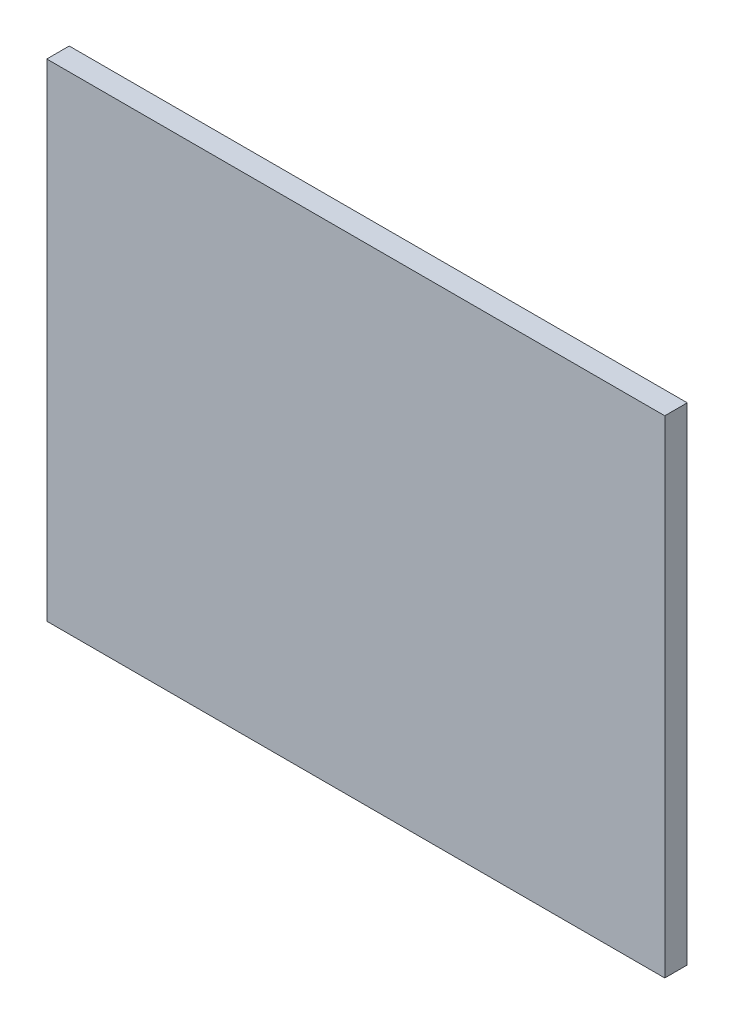
ISO-10303-21;
HEADER;
FILE_DESCRIPTION(('STEP AP214'),'2;1');
FILE_NAME('part.step','',(''),(''),'','','');
FILE_SCHEMA(('AUTOMOTIVE_DESIGN { 1 0 10303 214 1 1 1 1 }'));
ENDSEC;
DATA;
#1=APPLICATION_CONTEXT('core data for automotive mechanical design processes');
#2=APPLICATION_PROTOCOL_DEFINITION('international standard','automotive_design',2000,#1);
#3=PRODUCT_CONTEXT('',#1,'mechanical');
#4=PRODUCT('Part','Part','',(#3));
#5=PRODUCT_RELATED_PRODUCT_CATEGORY('part','',(#4));
#6=PRODUCT_DEFINITION_FORMATION('','',#4);
#7=PRODUCT_DEFINITION_CONTEXT('part definition',#1,'design');
#8=PRODUCT_DEFINITION('design','',#6,#7);
#9=PRODUCT_DEFINITION_SHAPE('','',#8);
#10=(LENGTH_UNIT() NAMED_UNIT(*) SI_UNIT(.MILLI.,.METRE.));
#11=(NAMED_UNIT(*) PLANE_ANGLE_UNIT() SI_UNIT($,.RADIAN.));
#12=(NAMED_UNIT(*) SI_UNIT($,.STERADIAN.) SOLID_ANGLE_UNIT());
#13=UNCERTAINTY_MEASURE_WITH_UNIT(LENGTH_MEASURE(1.E-05),#10,'distance_accuracy_value','');
#14=(GEOMETRIC_REPRESENTATION_CONTEXT(3) GLOBAL_UNCERTAINTY_ASSIGNED_CONTEXT((#13)) GLOBAL_UNIT_ASSIGNED_CONTEXT((#10,
#11,#12)) REPRESENTATION_CONTEXT('',''));
#15=CARTESIAN_POINT('',(0.,0.,0.));
#16=DIRECTION('',(0.,0.,1.));
#17=DIRECTION('',(1.,0.,0.));
#18=AXIS2_PLACEMENT_3D('',#15,#16,#17);
#19=CARTESIAN_POINT('',(-40.9964753587024,-31.7394260761073,1.5));
#20=DIRECTION('',(1.,0.,0.));
#21=DIRECTION('',(0.,0.,-1.));
#22=AXIS2_PLACEMENT_3D('',#19,#20,#21);
#23=PLANE('',#22);
#24=DIRECTION('',(0.,-1.,0.));
#25=VECTOR('',#24,1.);
#26=CARTESIAN_POINT('',(-40.9964753587024,-31.7394260761073,-1.5));
#27=LINE('',#26,#25);
#28=CARTESIAN_POINT('',(-40.9964753587024,33.2605739238927,-1.5));
#29=VERTEX_POINT('',#28);
#30=CARTESIAN_POINT('',(-40.9964753587024,-31.7394260761073,-1.5));
#31=VERTEX_POINT('',#30);
#32=EDGE_CURVE('E186',#29,#31,#27,.T.);
#33=ORIENTED_EDGE('',*,*,#32,.T.);
#34=DIRECTION('',(0.,0.,-1.));
#35=VECTOR('',#34,1.);
#36=CARTESIAN_POINT('',(-40.9964753587024,-31.7394260761073,1.5));
#37=LINE('',#36,#35);
#38=CARTESIAN_POINT('',(-40.9964753587024,-31.7394260761073,1.5));
#39=VERTEX_POINT('',#38);
#40=EDGE_CURVE('E11',#39,#31,#37,.T.);
#41=ORIENTED_EDGE('',*,*,#40,.F.);
#42=DIRECTION('',(0.,-1.,0.));
#43=VECTOR('',#42,1.);
#44=CARTESIAN_POINT('',(-40.9964753587024,-31.7394260761073,1.5));
#45=LINE('',#44,#43);
#46=CARTESIAN_POINT('',(-40.9964753587024,33.2605739238927,1.5));
#47=VERTEX_POINT('',#46);
#48=EDGE_CURVE('E192',#47,#39,#45,.T.);
#49=ORIENTED_EDGE('',*,*,#48,.F.);
#50=DIRECTION('',(0.,0.,-1.));
#51=VECTOR('',#50,1.);
#52=CARTESIAN_POINT('',(-40.9964753587024,33.2605739238927,1.5));
#53=LINE('',#52,#51);
#54=EDGE_CURVE('E202',#47,#29,#53,.T.);
#55=ORIENTED_EDGE('',*,*,#54,.T.);
#56=EDGE_LOOP('',(#33,#41,#49,#55));
#57=FACE_BOUND('',#56,.T.);
#58=ADVANCED_FACE('F32',(#57),#23,.F.);
#59=CARTESIAN_POINT('',(41.5035246412976,-31.7394260761073,1.5));
#60=DIRECTION('',(0.,1.,0.));
#61=DIRECTION('',(-1.,0.,0.));
#62=AXIS2_PLACEMENT_3D('',#59,#60,#61);
#63=PLANE('',#62);
#64=DIRECTION('',(1.,0.,0.));
#65=VECTOR('',#64,1.);
#66=CARTESIAN_POINT('',(41.5035246412976,-31.7394260761073,-1.5));
#67=LINE('',#66,#65);
#68=CARTESIAN_POINT('',(41.5035246412976,-31.7394260761073,-1.5));
#69=VERTEX_POINT('',#68);
#70=EDGE_CURVE('E205',#31,#69,#67,.T.);
#71=ORIENTED_EDGE('',*,*,#70,.T.);
#72=DIRECTION('',(0.,0.,-1.));
#73=VECTOR('',#72,1.);
#74=CARTESIAN_POINT('',(41.5035246412976,-31.7394260761073,1.5));
#75=LINE('',#74,#73);
#76=CARTESIAN_POINT('',(41.5035246412976,-31.7394260761073,1.5));
#77=VERTEX_POINT('',#76);
#78=EDGE_CURVE('E39',#77,#69,#75,.T.);
#79=ORIENTED_EDGE('',*,*,#78,.F.);
#80=DIRECTION('',(1.,0.,0.));
#81=VECTOR('',#80,1.);
#82=CARTESIAN_POINT('',(41.5035246412976,-31.7394260761073,1.5));
#83=LINE('',#82,#81);
#84=EDGE_CURVE('E195',#39,#77,#83,.T.);
#85=ORIENTED_EDGE('',*,*,#84,.F.);
#86=ORIENTED_EDGE('',*,*,#40,.T.);
#87=EDGE_LOOP('',(#71,#79,#85,#86));
#88=FACE_BOUND('',#87,.T.);
#89=ADVANCED_FACE('F235',(#88),#63,.F.);
#90=CARTESIAN_POINT('',(41.5035246412976,-31.7394260761073,1.5));
#91=DIRECTION('',(-1.,0.,0.));
#92=DIRECTION('',(0.,0.,1.));
#93=AXIS2_PLACEMENT_3D('',#90,#91,#92);
#94=PLANE('',#93);
#95=DIRECTION('',(0.,1.,0.));
#96=VECTOR('',#95,1.);
#97=CARTESIAN_POINT('',(41.5035246412976,-31.7394260761073,-1.5));
#98=LINE('',#97,#96);
#99=CARTESIAN_POINT('',(41.5035246412976,33.2605739238927,-1.5));
#100=VERTEX_POINT('',#99);
#101=EDGE_CURVE('E207',#69,#100,#98,.T.);
#102=ORIENTED_EDGE('',*,*,#101,.T.);
#103=DIRECTION('',(0.,0.,-1.));
#104=VECTOR('',#103,1.);
#105=CARTESIAN_POINT('',(41.5035246412976,33.2605739238927,1.5));
#106=LINE('',#105,#104);
#107=CARTESIAN_POINT('',(41.5035246412976,33.2605739238927,1.5));
#108=VERTEX_POINT('',#107);
#109=EDGE_CURVE('E212',#108,#100,#106,.T.);
#110=ORIENTED_EDGE('',*,*,#109,.F.);
#111=DIRECTION('',(0.,1.,0.));
#112=VECTOR('',#111,1.);
#113=CARTESIAN_POINT('',(41.5035246412976,-31.7394260761073,1.5));
#114=LINE('',#113,#112);
#115=EDGE_CURVE('E198',#77,#108,#114,.T.);
#116=ORIENTED_EDGE('',*,*,#115,.F.);
#117=ORIENTED_EDGE('',*,*,#78,.T.);
#118=EDGE_LOOP('',(#102,#110,#116,#117));
#119=FACE_BOUND('',#118,.T.);
#120=ADVANCED_FACE('F219',(#119),#94,.F.);
#121=CARTESIAN_POINT('',(41.5035246412976,33.2605739238927,1.5));
#122=DIRECTION('',(0.,-1.,0.));
#123=DIRECTION('',(0.,0.,-1.));
#124=AXIS2_PLACEMENT_3D('',#121,#122,#123);
#125=PLANE('',#124);
#126=DIRECTION('',(-1.,0.,0.));
#127=VECTOR('',#126,1.);
#128=CARTESIAN_POINT('',(41.5035246412976,33.2605739238927,-1.5));
#129=LINE('',#128,#127);
#130=EDGE_CURVE('E196',#100,#29,#129,.T.);
#131=ORIENTED_EDGE('',*,*,#130,.T.);
#132=ORIENTED_EDGE('',*,*,#54,.F.);
#133=DIRECTION('',(-1.,0.,0.));
#134=VECTOR('',#133,1.);
#135=CARTESIAN_POINT('',(41.5035246412976,33.2605739238927,1.5));
#136=LINE('',#135,#134);
#137=EDGE_CURVE('E200',#108,#47,#136,.T.);
#138=ORIENTED_EDGE('',*,*,#137,.F.);
#139=ORIENTED_EDGE('',*,*,#109,.T.);
#140=EDGE_LOOP('',(#131,#132,#138,#139));
#141=FACE_BOUND('',#140,.T.);
#142=ADVANCED_FACE('F228',(#141),#125,.F.);
#143=CARTESIAN_POINT('',(0.,0.,1.5));
#144=DIRECTION('',(0.,0.,1.));
#145=DIRECTION('',(1.,0.,0.));
#146=AXIS2_PLACEMENT_3D('',#143,#144,#145);
#147=PLANE('',#146);
#148=ORIENTED_EDGE('',*,*,#48,.T.);
#149=ORIENTED_EDGE('',*,*,#84,.T.);
#150=ORIENTED_EDGE('',*,*,#115,.T.);
#151=ORIENTED_EDGE('',*,*,#137,.T.);
#152=EDGE_LOOP('',(#148,#149,#150,#151));
#153=FACE_BOUND('',#152,.T.);
#154=ADVANCED_FACE('F234',(#153),#147,.T.);
#155=CARTESIAN_POINT('',(0.,0.,-1.5));
#156=DIRECTION('',(0.,0.,1.));
#157=DIRECTION('',(1.,0.,0.));
#158=AXIS2_PLACEMENT_3D('',#155,#156,#157);
#159=PLANE('',#158);
#160=DIRECTION('',(-1.,0.,0.));
#161=VECTOR('',#160,1.);
#162=CARTESIAN_POINT('',(37.3212385683419,-28.1056415969347,-1.5));
#163=LINE('',#162,#161);
#164=CARTESIAN_POINT('',(37.3212385683419,-28.1056415969347,-1.5));
#165=VERTEX_POINT('',#164);
#166=CARTESIAN_POINT('',(-38.0015055514087,-28.1056415969348,-1.5));
#167=VERTEX_POINT('',#166);
#168=EDGE_CURVE('E176',#165,#167,#163,.T.);
#169=ORIENTED_EDGE('',*,*,#168,.F.);
#170=DIRECTION('',(0.,-1.,0.));
#171=VECTOR('',#170,1.);
#172=CARTESIAN_POINT('',(37.3212385683419,28.1002399602976,-1.5));
#173=LINE('',#172,#171);
#174=CARTESIAN_POINT('',(37.3212385683419,28.1002399602976,-1.5));
#175=VERTEX_POINT('',#174);
#176=EDGE_CURVE('E46',#175,#165,#173,.T.);
#177=ORIENTED_EDGE('',*,*,#176,.F.);
#178=DIRECTION('',(1.,0.,0.));
#179=VECTOR('',#178,1.);
#180=CARTESIAN_POINT('',(-38.0015055514087,28.1002399602976,-1.5));
#181=LINE('',#180,#179);
#182=CARTESIAN_POINT('',(-38.0015055514087,28.1002399602976,-1.5));
#183=VERTEX_POINT('',#182);
#184=EDGE_CURVE('E165',#183,#175,#181,.T.);
#185=ORIENTED_EDGE('',*,*,#184,.F.);
#186=DIRECTION('',(0.,1.,0.));
#187=VECTOR('',#186,1.);
#188=CARTESIAN_POINT('',(-38.0015055514087,-28.1056415969348,-1.5));
#189=LINE('',#188,#187);
#190=EDGE_CURVE('E179',#167,#183,#189,.T.);
#191=ORIENTED_EDGE('',*,*,#190,.F.);
#192=EDGE_LOOP('',(#169,#177,#185,#191));
#193=FACE_BOUND('',#192,.T.);
#194=ORIENTED_EDGE('',*,*,#32,.F.);
#195=ORIENTED_EDGE('',*,*,#130,.F.);
#196=ORIENTED_EDGE('',*,*,#101,.F.);
#197=ORIENTED_EDGE('',*,*,#70,.F.);
#198=EDGE_LOOP('',(#194,#195,#196,#197));
#199=FACE_BOUND('',#198,.T.);
#200=ADVANCED_FACE('F225',(#193,#199),#159,.F.);
#201=CARTESIAN_POINT('',(37.3212385683419,28.1002399602976,0.));
#202=DIRECTION('',(1.,0.,0.));
#203=DIRECTION('',(0.,0.,-1.));
#204=AXIS2_PLACEMENT_3D('',#201,#202,#203);
#205=PLANE('',#204);
#206=ORIENTED_EDGE('',*,*,#176,.T.);
#207=DIRECTION('',(0.,0.,-1.));
#208=VECTOR('',#207,1.);
#209=CARTESIAN_POINT('',(37.3212385683419,-28.1056415969347,0.));
#210=LINE('',#209,#208);
#211=CARTESIAN_POINT('',(37.3212385683419,-28.1056415969347,0.));
#212=VERTEX_POINT('',#211);
#213=EDGE_CURVE('E174',#212,#165,#210,.T.);
#214=ORIENTED_EDGE('',*,*,#213,.F.);
#215=DIRECTION('',(0.,-1.,0.));
#216=VECTOR('',#215,1.);
#217=CARTESIAN_POINT('',(37.3212385683419,28.1002399602976,0.));
#218=LINE('',#217,#216);
#219=CARTESIAN_POINT('',(37.3212385683419,28.1002399602976,0.));
#220=VERTEX_POINT('',#219);
#221=EDGE_CURVE('E161',#220,#212,#218,.T.);
#222=ORIENTED_EDGE('',*,*,#221,.F.);
#223=DIRECTION('',(0.,0.,-1.));
#224=VECTOR('',#223,1.);
#225=CARTESIAN_POINT('',(37.3212385683419,28.1002399602976,0.));
#226=LINE('',#225,#224);
#227=EDGE_CURVE('E184',#220,#175,#226,.T.);
#228=ORIENTED_EDGE('',*,*,#227,.T.);
#229=EDGE_LOOP('',(#206,#214,#222,#228));
#230=FACE_BOUND('',#229,.T.);
#231=ADVANCED_FACE('F247',(#230),#205,.F.);
#232=CARTESIAN_POINT('',(-38.0015055514087,28.1002399602976,0.));
#233=DIRECTION('',(0.,1.,0.));
#234=DIRECTION('',(-1.,0.,0.));
#235=AXIS2_PLACEMENT_3D('',#232,#233,#234);
#236=PLANE('',#235);
#237=ORIENTED_EDGE('',*,*,#184,.T.);
#238=ORIENTED_EDGE('',*,*,#227,.F.);
#239=DIRECTION('',(1.,0.,0.));
#240=VECTOR('',#239,1.);
#241=CARTESIAN_POINT('',(-38.0015055514087,28.1002399602976,0.));
#242=LINE('',#241,#240);
#243=CARTESIAN_POINT('',(-38.0015055514087,28.1002399602976,0.));
#244=VERTEX_POINT('',#243);
#245=EDGE_CURVE('E171',#244,#220,#242,.T.);
#246=ORIENTED_EDGE('',*,*,#245,.F.);
#247=DIRECTION('',(0.,0.,-1.));
#248=VECTOR('',#247,1.);
#249=CARTESIAN_POINT('',(-38.0015055514087,28.1002399602976,0.));
#250=LINE('',#249,#248);
#251=EDGE_CURVE('E187',#244,#183,#250,.T.);
#252=ORIENTED_EDGE('',*,*,#251,.T.);
#253=EDGE_LOOP('',(#237,#238,#246,#252));
#254=FACE_BOUND('',#253,.T.);
#255=ADVANCED_FACE('F254',(#254),#236,.F.);
#256=CARTESIAN_POINT('',(-38.0015055514087,-28.1056415969348,0.));
#257=DIRECTION('',(-1.,0.,0.));
#258=DIRECTION('',(0.,0.,1.));
#259=AXIS2_PLACEMENT_3D('',#256,#257,#258);
#260=PLANE('',#259);
#261=ORIENTED_EDGE('',*,*,#190,.T.);
#262=ORIENTED_EDGE('',*,*,#251,.F.);
#263=DIRECTION('',(0.,1.,0.));
#264=VECTOR('',#263,1.);
#265=CARTESIAN_POINT('',(-38.0015055514087,-28.1056415969348,0.));
#266=LINE('',#265,#264);
#267=CARTESIAN_POINT('',(-38.0015055514087,-28.1056415969348,0.));
#268=VERTEX_POINT('',#267);
#269=EDGE_CURVE('E168',#268,#244,#266,.T.);
#270=ORIENTED_EDGE('',*,*,#269,.F.);
#271=DIRECTION('',(0.,0.,-1.));
#272=VECTOR('',#271,1.);
#273=CARTESIAN_POINT('',(-38.0015055514087,-28.1056415969348,0.));
#274=LINE('',#273,#272);
#275=EDGE_CURVE('E189',#268,#167,#274,.T.);
#276=ORIENTED_EDGE('',*,*,#275,.T.);
#277=EDGE_LOOP('',(#261,#262,#270,#276));
#278=FACE_BOUND('',#277,.T.);
#279=ADVANCED_FACE('F258',(#278),#260,.F.);
#280=CARTESIAN_POINT('',(37.3212385683419,-28.1056415969347,0.));
#281=DIRECTION('',(0.,-1.,0.));
#282=DIRECTION('',(1.,0.,0.));
#283=AXIS2_PLACEMENT_3D('',#280,#281,#282);
#284=PLANE('',#283);
#285=ORIENTED_EDGE('',*,*,#168,.T.);
#286=ORIENTED_EDGE('',*,*,#275,.F.);
#287=DIRECTION('',(-1.,0.,0.));
#288=VECTOR('',#287,1.);
#289=CARTESIAN_POINT('',(37.3212385683419,-28.1056415969347,0.));
#290=LINE('',#289,#288);
#291=EDGE_CURVE('E164',#212,#268,#290,.T.);
#292=ORIENTED_EDGE('',*,*,#291,.F.);
#293=ORIENTED_EDGE('',*,*,#213,.T.);
#294=EDGE_LOOP('',(#285,#286,#292,#293));
#295=FACE_BOUND('',#294,.T.);
#296=ADVANCED_FACE('F255',(#295),#284,.F.);
#297=CARTESIAN_POINT('',(0.,0.,0.));
#298=DIRECTION('',(0.,0.,-1.));
#299=DIRECTION('',(-1.,0.,0.));
#300=AXIS2_PLACEMENT_3D('',#297,#298,#299);
#301=PLANE('',#300);
#302=DIRECTION('',(1.,0.,0.));
#303=VECTOR('',#302,1.);
#304=CARTESIAN_POINT('',(-36.5015055514087,26.6002399602976,0.));
#305=LINE('',#304,#303);
#306=CARTESIAN_POINT('',(-36.5015055514087,26.6002399602976,0.));
#307=VERTEX_POINT('',#306);
#308=CARTESIAN_POINT('',(35.8212385683419,26.6002399602976,0.));
#309=VERTEX_POINT('',#308);
#310=EDGE_CURVE('E132',#307,#309,#305,.T.);
#311=ORIENTED_EDGE('',*,*,#310,.F.);
#312=DIRECTION('',(0.,1.,0.));
#313=VECTOR('',#312,1.);
#314=CARTESIAN_POINT('',(-36.5015055514087,-26.6056415969348,0.));
#315=LINE('',#314,#313);
#316=CARTESIAN_POINT('',(-36.5015055514087,-26.6056415969348,0.));
#317=VERTEX_POINT('',#316);
#318=EDGE_CURVE('E142',#317,#307,#315,.T.);
#319=ORIENTED_EDGE('',*,*,#318,.F.);
#320=DIRECTION('',(-1.,0.,0.));
#321=VECTOR('',#320,1.);
#322=CARTESIAN_POINT('',(35.8212385683419,-26.6056415969348,0.));
#323=LINE('',#322,#321);
#324=CARTESIAN_POINT('',(35.8212385683419,-26.6056415969348,0.));
#325=VERTEX_POINT('',#324);
#326=EDGE_CURVE('E124',#325,#317,#323,.T.);
#327=ORIENTED_EDGE('',*,*,#326,.F.);
#328=DIRECTION('',(0.,-1.,0.));
#329=VECTOR('',#328,1.);
#330=CARTESIAN_POINT('',(35.8212385683419,26.6002399602976,0.));
#331=LINE('',#330,#329);
#332=EDGE_CURVE('E139',#309,#325,#331,.T.);
#333=ORIENTED_EDGE('',*,*,#332,.F.);
#334=EDGE_LOOP('',(#311,#319,#327,#333));
#335=FACE_BOUND('',#334,.T.);
#336=ORIENTED_EDGE('',*,*,#221,.T.);
#337=ORIENTED_EDGE('',*,*,#291,.T.);
#338=ORIENTED_EDGE('',*,*,#269,.T.);
#339=ORIENTED_EDGE('',*,*,#245,.T.);
#340=EDGE_LOOP('',(#336,#337,#338,#339));
#341=FACE_BOUND('',#340,.T.);
#342=ADVANCED_FACE('F137',(#335,#341),#301,.T.);
#343=CARTESIAN_POINT('',(35.8212385683419,26.6002399602976,0.));
#344=DIRECTION('',(1.,0.,0.));
#345=DIRECTION('',(0.,0.,-1.));
#346=AXIS2_PLACEMENT_3D('',#343,#344,#345);
#347=PLANE('',#346);
#348=DIRECTION('',(0.,-1.,0.));
#349=VECTOR('',#348,1.);
#350=CARTESIAN_POINT('',(35.8212385683419,26.6002399602976,-1.5));
#351=LINE('',#350,#349);
#352=CARTESIAN_POINT('',(35.8212385683419,26.6002399602976,-1.5));
#353=VERTEX_POINT('',#352);
#354=CARTESIAN_POINT('',(35.8212385683419,-26.6056415969348,-1.5));
#355=VERTEX_POINT('',#354);
#356=EDGE_CURVE('E153',#353,#355,#351,.T.);
#357=ORIENTED_EDGE('',*,*,#356,.F.);
#358=DIRECTION('',(0.,0.,-1.));
#359=VECTOR('',#358,1.);
#360=CARTESIAN_POINT('',(35.8212385683419,26.6002399602976,0.));
#361=LINE('',#360,#359);
#362=EDGE_CURVE('E145',#309,#353,#361,.T.);
#363=ORIENTED_EDGE('',*,*,#362,.F.);
#364=ORIENTED_EDGE('',*,*,#332,.T.);
#365=DIRECTION('',(0.,0.,-1.));
#366=VECTOR('',#365,1.);
#367=CARTESIAN_POINT('',(35.8212385683419,-26.6056415969348,0.));
#368=LINE('',#367,#366);
#369=EDGE_CURVE('E121',#325,#355,#368,.T.);
#370=ORIENTED_EDGE('',*,*,#369,.T.);
#371=EDGE_LOOP('',(#357,#363,#364,#370));
#372=FACE_BOUND('',#371,.T.);
#373=ADVANCED_FACE('F144',(#372),#347,.T.);
#374=CARTESIAN_POINT('',(-36.5015055514087,26.6002399602976,0.));
#375=DIRECTION('',(0.,1.,0.));
#376=DIRECTION('',(-1.,0.,0.));
#377=AXIS2_PLACEMENT_3D('',#374,#375,#376);
#378=PLANE('',#377);
#379=DIRECTION('',(1.,0.,0.));
#380=VECTOR('',#379,1.);
#381=CARTESIAN_POINT('',(-36.5015055514087,26.6002399602976,-1.5));
#382=LINE('',#381,#380);
#383=CARTESIAN_POINT('',(-36.5015055514087,26.6002399602976,-1.5));
#384=VERTEX_POINT('',#383);
#385=EDGE_CURVE('E146',#384,#353,#382,.T.);
#386=ORIENTED_EDGE('',*,*,#385,.F.);
#387=DIRECTION('',(0.,0.,-1.));
#388=VECTOR('',#387,1.);
#389=CARTESIAN_POINT('',(-36.5015055514087,26.6002399602976,0.));
#390=LINE('',#389,#388);
#391=EDGE_CURVE('E158',#307,#384,#390,.T.);
#392=ORIENTED_EDGE('',*,*,#391,.F.);
#393=ORIENTED_EDGE('',*,*,#310,.T.);
#394=ORIENTED_EDGE('',*,*,#362,.T.);
#395=EDGE_LOOP('',(#386,#392,#393,#394));
#396=FACE_BOUND('',#395,.T.);
#397=ADVANCED_FACE('F270',(#396),#378,.T.);
#398=CARTESIAN_POINT('',(-36.5015055514087,-26.6056415969348,0.));
#399=DIRECTION('',(-1.,0.,0.));
#400=DIRECTION('',(0.,0.,1.));
#401=AXIS2_PLACEMENT_3D('',#398,#399,#400);
#402=PLANE('',#401);
#403=DIRECTION('',(0.,1.,0.));
#404=VECTOR('',#403,1.);
#405=CARTESIAN_POINT('',(-36.5015055514087,-26.6056415969348,-1.5));
#406=LINE('',#405,#404);
#407=CARTESIAN_POINT('',(-36.5015055514087,-26.6056415969348,-1.5));
#408=VERTEX_POINT('',#407);
#409=EDGE_CURVE('E54',#408,#384,#406,.T.);
#410=ORIENTED_EDGE('',*,*,#409,.F.);
#411=DIRECTION('',(0.,0.,-1.));
#412=VECTOR('',#411,1.);
#413=CARTESIAN_POINT('',(-36.5015055514087,-26.6056415969348,0.));
#414=LINE('',#413,#412);
#415=EDGE_CURVE('E131',#317,#408,#414,.T.);
#416=ORIENTED_EDGE('',*,*,#415,.F.);
#417=ORIENTED_EDGE('',*,*,#318,.T.);
#418=ORIENTED_EDGE('',*,*,#391,.T.);
#419=EDGE_LOOP('',(#410,#416,#417,#418));
#420=FACE_BOUND('',#419,.T.);
#421=ADVANCED_FACE('F273',(#420),#402,.T.);
#422=CARTESIAN_POINT('',(35.8212385683419,-26.6056415969348,0.));
#423=DIRECTION('',(0.,-1.,0.));
#424=DIRECTION('',(1.,0.,0.));
#425=AXIS2_PLACEMENT_3D('',#422,#423,#424);
#426=PLANE('',#425);
#427=DIRECTION('',(-1.,0.,0.));
#428=VECTOR('',#427,1.);
#429=CARTESIAN_POINT('',(35.8212385683419,-26.6056415969348,-1.5));
#430=LINE('',#429,#428);
#431=EDGE_CURVE('E126',#355,#408,#430,.T.);
#432=ORIENTED_EDGE('',*,*,#431,.F.);
#433=ORIENTED_EDGE('',*,*,#369,.F.);
#434=ORIENTED_EDGE('',*,*,#326,.T.);
#435=ORIENTED_EDGE('',*,*,#415,.T.);
#436=EDGE_LOOP('',(#432,#433,#434,#435));
#437=FACE_BOUND('',#436,.T.);
#438=ADVANCED_FACE('F123',(#437),#426,.T.);
#439=ORIENTED_EDGE('',*,*,#356,.T.);
#440=ORIENTED_EDGE('',*,*,#431,.T.);
#441=ORIENTED_EDGE('',*,*,#409,.T.);
#442=ORIENTED_EDGE('',*,*,#385,.T.);
#443=EDGE_LOOP('',(#439,#440,#441,#442));
#444=FACE_BOUND('',#443,.T.);
#445=ADVANCED_FACE('F249',(#444),#159,.F.);
#446=CLOSED_SHELL('',(#58,#89,#120,#142,#154,#200,#231,#255,#279,#296,#342,#373,#397,#421,#438,#445));
#447=MANIFOLD_SOLID_BREP('B2',#446);
#448=ADVANCED_BREP_SHAPE_REPRESENTATION('',(#18,#447),#14);
#449=SHAPE_DEFINITION_REPRESENTATION(#9,#448);
ENDSEC;
END-ISO-10303-21;
